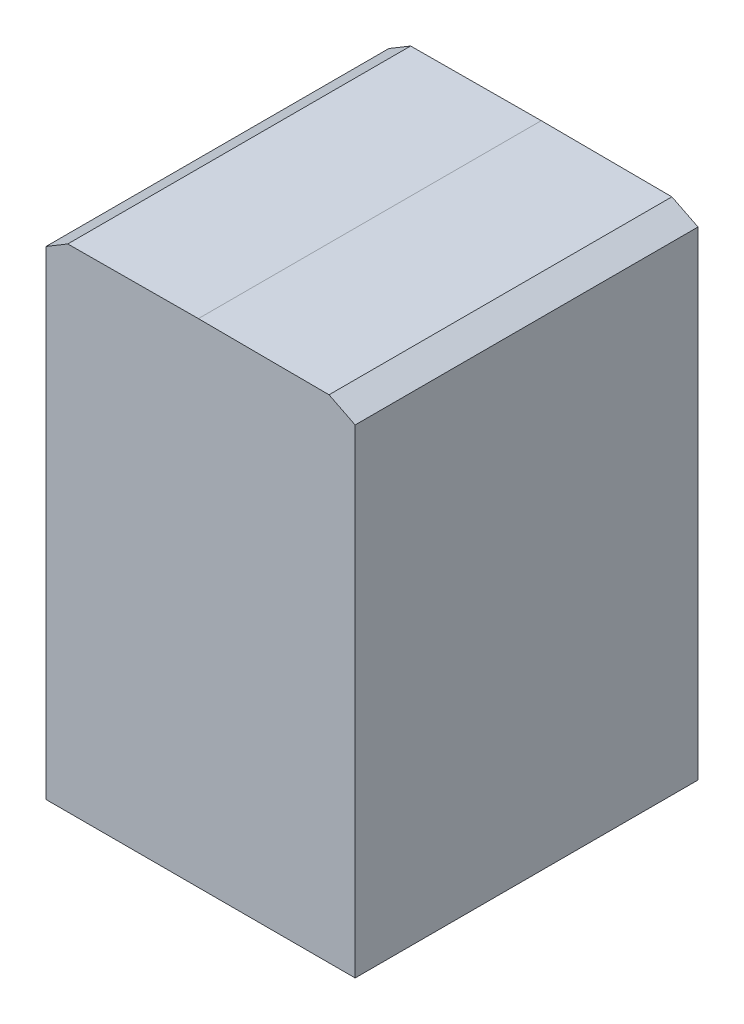
ISO-10303-21;
HEADER;
FILE_DESCRIPTION(('STEP AP214'),'2;1');
FILE_NAME('part.step','',(''),(''),'','','');
FILE_SCHEMA(('AUTOMOTIVE_DESIGN { 1 0 10303 214 1 1 1 1 }'));
ENDSEC;
DATA;
#1=APPLICATION_CONTEXT('core data for automotive mechanical design processes');
#2=APPLICATION_PROTOCOL_DEFINITION('international standard','automotive_design',2000,#1);
#3=PRODUCT_CONTEXT('',#1,'mechanical');
#4=PRODUCT('Part','Part','',(#3));
#5=PRODUCT_RELATED_PRODUCT_CATEGORY('part','',(#4));
#6=PRODUCT_DEFINITION_FORMATION('','',#4);
#7=PRODUCT_DEFINITION_CONTEXT('part definition',#1,'design');
#8=PRODUCT_DEFINITION('design','',#6,#7);
#9=PRODUCT_DEFINITION_SHAPE('','',#8);
#10=(LENGTH_UNIT() NAMED_UNIT(*) SI_UNIT(.MILLI.,.METRE.));
#11=(NAMED_UNIT(*) PLANE_ANGLE_UNIT() SI_UNIT($,.RADIAN.));
#12=(NAMED_UNIT(*) SI_UNIT($,.STERADIAN.) SOLID_ANGLE_UNIT());
#13=UNCERTAINTY_MEASURE_WITH_UNIT(LENGTH_MEASURE(1.E-05),#10,'distance_accuracy_value','');
#14=(GEOMETRIC_REPRESENTATION_CONTEXT(3) GLOBAL_UNCERTAINTY_ASSIGNED_CONTEXT((#13)) GLOBAL_UNIT_ASSIGNED_CONTEXT((#10,
#11,#12)) REPRESENTATION_CONTEXT('',''));
#15=CARTESIAN_POINT('',(0.,0.,0.));
#16=DIRECTION('',(0.,0.,1.));
#17=DIRECTION('',(1.,0.,0.));
#18=AXIS2_PLACEMENT_3D('',#15,#16,#17);
#19=CARTESIAN_POINT('',(-4.5085,6.7849623,0.));
#20=DIRECTION('',(-0.514495755428115,0.857492925712191,0.));
#21=DIRECTION('',(-0.857492925712191,-0.514495755428115,0.));
#22=AXIS2_PLACEMENT_3D('',#19,#20,#21);
#23=PLANE('',#22);
#24=DIRECTION('',(0.,0.,1.));
#25=VECTOR('',#24,1.);
#26=CARTESIAN_POINT('',(-3.8735,7.1659623,0.));
#27=LINE('',#26,#25);
#28=CARTESIAN_POINT('',(-3.87350000000013,7.16596230000022,0.));
#29=VERTEX_POINT('',#28);
#30=CARTESIAN_POINT('',(-3.87350000000013,7.16596230000022,10.));
#31=VERTEX_POINT('',#30);
#32=EDGE_CURVE('E94',#29,#31,#27,.T.);
#33=ORIENTED_EDGE('',*,*,#32,.F.);
#34=DIRECTION('',(-0.857492925712191,-0.514495755428115,0.));
#35=VECTOR('',#34,1.);
#36=CARTESIAN_POINT('',(-4.5085,6.7849623,0.));
#37=LINE('',#36,#35);
#38=CARTESIAN_POINT('',(-4.5085,6.7849623,0.));
#39=VERTEX_POINT('',#38);
#40=EDGE_CURVE('E89',#29,#39,#37,.T.);
#41=ORIENTED_EDGE('',*,*,#40,.T.);
#42=DIRECTION('',(0.,0.,1.));
#43=VECTOR('',#42,1.);
#44=CARTESIAN_POINT('',(-4.5085,6.7849623,0.));
#45=LINE('',#44,#43);
#46=CARTESIAN_POINT('',(-4.5085,6.7849623,10.));
#47=VERTEX_POINT('',#46);
#48=EDGE_CURVE('E91',#47,#39,#45,.F.);
#49=ORIENTED_EDGE('',*,*,#48,.F.);
#50=DIRECTION('',(-0.857492925712191,-0.514495755428115,0.));
#51=VECTOR('',#50,1.);
#52=CARTESIAN_POINT('',(-4.5085,6.7849623,10.));
#53=LINE('',#52,#51);
#54=EDGE_CURVE('E20',#47,#31,#53,.F.);
#55=ORIENTED_EDGE('',*,*,#54,.T.);
#56=EDGE_LOOP('',(#33,#41,#49,#55));
#57=FACE_BOUND('',#56,.T.);
#58=ADVANCED_FACE('F17',(#57),#23,.T.);
#59=CARTESIAN_POINT('',(-4.5085,-7.1850377,0.));
#60=DIRECTION('',(-1.,0.,0.));
#61=DIRECTION('',(0.,0.,1.));
#62=AXIS2_PLACEMENT_3D('',#59,#60,#61);
#63=PLANE('',#62);
#64=ORIENTED_EDGE('',*,*,#48,.T.);
#65=DIRECTION('',(0.,1.,0.));
#66=VECTOR('',#65,1.);
#67=CARTESIAN_POINT('',(-4.5085,6.7849623,0.));
#68=LINE('',#67,#66);
#69=CARTESIAN_POINT('',(-4.5085,-7.1850377,0.));
#70=VERTEX_POINT('',#69);
#71=EDGE_CURVE('E129',#39,#70,#68,.F.);
#72=ORIENTED_EDGE('',*,*,#71,.T.);
#73=DIRECTION('',(0.,0.,-1.));
#74=VECTOR('',#73,1.);
#75=CARTESIAN_POINT('',(-4.5085,-7.1850377,0.));
#76=LINE('',#75,#74);
#77=CARTESIAN_POINT('',(-4.5085,-7.1850377,10.));
#78=VERTEX_POINT('',#77);
#79=EDGE_CURVE('E97',#78,#70,#76,.T.);
#80=ORIENTED_EDGE('',*,*,#79,.F.);
#81=DIRECTION('',(0.,1.,0.));
#82=VECTOR('',#81,1.);
#83=CARTESIAN_POINT('',(-4.5085,6.7849623,10.));
#84=LINE('',#83,#82);
#85=EDGE_CURVE('E81',#47,#78,#84,.F.);
#86=ORIENTED_EDGE('',*,*,#85,.F.);
#87=EDGE_LOOP('',(#64,#72,#80,#86));
#88=FACE_BOUND('',#87,.T.);
#89=ADVANCED_FACE('F96',(#88),#63,.T.);
#90=CARTESIAN_POINT('',(-0.06349999999999,7.1850377,0.));
#91=DIRECTION('',(0.00500660391751134,0.999987466880067,0.));
#92=DIRECTION('',(-0.999987466880067,0.00500660391751134,0.));
#93=AXIS2_PLACEMENT_3D('',#90,#91,#92);
#94=PLANE('',#93);
#95=DIRECTION('',(0.,0.,1.));
#96=VECTOR('',#95,1.);
#97=CARTESIAN_POINT('',(3.7465,7.1659623,0.));
#98=LINE('',#97,#96);
#99=CARTESIAN_POINT('',(3.7465,7.1659623,0.));
#100=VERTEX_POINT('',#99);
#101=CARTESIAN_POINT('',(3.7465,7.1659623,10.));
#102=VERTEX_POINT('',#101);
#103=EDGE_CURVE('E73',#100,#102,#98,.T.);
#104=ORIENTED_EDGE('',*,*,#103,.F.);
#105=DIRECTION('',(-0.999987466880067,0.00500660391751278,0.));
#106=VECTOR('',#105,1.);
#107=CARTESIAN_POINT('',(3.7465,7.1659623,0.));
#108=LINE('',#107,#106);
#109=CARTESIAN_POINT('',(-0.0634999999990455,7.1850377,0.));
#110=VERTEX_POINT('',#109);
#111=EDGE_CURVE('E118',#100,#110,#108,.T.);
#112=ORIENTED_EDGE('',*,*,#111,.T.);
#113=DIRECTION('',(0.,0.,1.));
#114=VECTOR('',#113,1.);
#115=CARTESIAN_POINT('',(-0.0634999999999898,7.18503769999999,0.));
#116=LINE('',#115,#114);
#117=CARTESIAN_POINT('',(-0.0634999999990455,7.1850377,10.));
#118=VERTEX_POINT('',#117);
#119=EDGE_CURVE('E104',#118,#110,#116,.F.);
#120=ORIENTED_EDGE('',*,*,#119,.F.);
#121=DIRECTION('',(-0.999987466880067,0.00500660391751278,0.));
#122=VECTOR('',#121,1.);
#123=CARTESIAN_POINT('',(3.7465,7.1659623,10.));
#124=LINE('',#123,#122);
#125=EDGE_CURVE('E102',#102,#118,#124,.T.);
#126=ORIENTED_EDGE('',*,*,#125,.F.);
#127=EDGE_LOOP('',(#104,#112,#120,#126));
#128=FACE_BOUND('',#127,.T.);
#129=ADVANCED_FACE('F136',(#128),#94,.T.);
#130=CARTESIAN_POINT('',(-3.8735,7.1659623,0.));
#131=DIRECTION('',(-0.00500660391751134,0.999987466880067,0.));
#132=DIRECTION('',(-0.999987466880067,-0.00500660391751134,0.));
#133=AXIS2_PLACEMENT_3D('',#130,#131,#132);
#134=PLANE('',#133);
#135=ORIENTED_EDGE('',*,*,#119,.T.);
#136=DIRECTION('',(-0.999987466880067,-0.00500660391751275,0.));
#137=VECTOR('',#136,1.);
#138=CARTESIAN_POINT('',(-0.0634999999999898,7.1850377,0.));
#139=LINE('',#138,#137);
#140=EDGE_CURVE('E114',#110,#29,#139,.T.);
#141=ORIENTED_EDGE('',*,*,#140,.T.);
#142=ORIENTED_EDGE('',*,*,#32,.T.);
#143=DIRECTION('',(-0.999987466880067,-0.00500660391751275,0.));
#144=VECTOR('',#143,1.);
#145=CARTESIAN_POINT('',(-0.0634999999999898,7.1850377,10.));
#146=LINE('',#145,#144);
#147=EDGE_CURVE('E85',#118,#31,#146,.T.);
#148=ORIENTED_EDGE('',*,*,#147,.F.);
#149=EDGE_LOOP('',(#135,#141,#142,#148));
#150=FACE_BOUND('',#149,.T.);
#151=ADVANCED_FACE('F112',(#150),#134,.T.);
#152=CARTESIAN_POINT('',(3.7465,7.1659623,0.));
#153=DIRECTION('',(0.447213595499958,0.894427190999916,0.));
#154=DIRECTION('',(-0.894427190999916,0.447213595499958,0.));
#155=AXIS2_PLACEMENT_3D('',#152,#153,#154);
#156=PLANE('',#155);
#157=DIRECTION('',(0.,0.,-1.));
#158=VECTOR('',#157,1.);
#159=CARTESIAN_POINT('',(4.5085,6.7849623,0.));
#160=LINE('',#159,#158);
#161=CARTESIAN_POINT('',(4.5085,6.7849623,0.));
#162=VERTEX_POINT('',#161);
#163=CARTESIAN_POINT('',(4.5085,6.7849623,10.));
#164=VERTEX_POINT('',#163);
#165=EDGE_CURVE('E117',#162,#164,#160,.F.);
#166=ORIENTED_EDGE('',*,*,#165,.F.);
#167=DIRECTION('',(-0.894427190999916,0.447213595499959,0.));
#168=VECTOR('',#167,1.);
#169=CARTESIAN_POINT('',(4.5085,6.7849623,0.));
#170=LINE('',#169,#168);
#171=EDGE_CURVE('E123',#162,#100,#170,.T.);
#172=ORIENTED_EDGE('',*,*,#171,.T.);
#173=ORIENTED_EDGE('',*,*,#103,.T.);
#174=DIRECTION('',(-0.894427190999916,0.447213595499959,0.));
#175=VECTOR('',#174,1.);
#176=CARTESIAN_POINT('',(4.5085,6.7849623,10.));
#177=LINE('',#176,#175);
#178=EDGE_CURVE('E99',#164,#102,#177,.T.);
#179=ORIENTED_EDGE('',*,*,#178,.F.);
#180=EDGE_LOOP('',(#166,#172,#173,#179));
#181=FACE_BOUND('',#180,.T.);
#182=ADVANCED_FACE('F153',(#181),#156,.T.);
#183=CARTESIAN_POINT('',(-4.5085,6.7849623,10.));
#184=DIRECTION('',(0.,0.,1.));
#185=DIRECTION('',(1.,0.,0.));
#186=AXIS2_PLACEMENT_3D('',#183,#184,#185);
#187=PLANE('',#186);
#188=ORIENTED_EDGE('',*,*,#147,.T.);
#189=ORIENTED_EDGE('',*,*,#54,.F.);
#190=ORIENTED_EDGE('',*,*,#85,.T.);
#191=DIRECTION('',(1.,0.,0.));
#192=VECTOR('',#191,1.);
#193=CARTESIAN_POINT('',(4.5085,-7.1850377,10.));
#194=LINE('',#193,#192);
#195=CARTESIAN_POINT('',(4.5085,-7.1850377,10.));
#196=VERTEX_POINT('',#195);
#197=EDGE_CURVE('E132',#196,#78,#194,.F.);
#198=ORIENTED_EDGE('',*,*,#197,.F.);
#199=DIRECTION('',(0.,1.,0.));
#200=VECTOR('',#199,1.);
#201=CARTESIAN_POINT('',(4.5085,6.7849623,10.));
#202=LINE('',#201,#200);
#203=EDGE_CURVE('E121',#164,#196,#202,.F.);
#204=ORIENTED_EDGE('',*,*,#203,.F.);
#205=ORIENTED_EDGE('',*,*,#178,.T.);
#206=ORIENTED_EDGE('',*,*,#125,.T.);
#207=EDGE_LOOP('',(#188,#189,#190,#198,#204,#205,#206));
#208=FACE_BOUND('',#207,.T.);
#209=ADVANCED_FACE('F79',(#208),#187,.T.);
#210=CARTESIAN_POINT('',(4.5085,-7.1850377,0.));
#211=DIRECTION('',(0.,-1.,0.));
#212=DIRECTION('',(0.,0.,-1.));
#213=AXIS2_PLACEMENT_3D('',#210,#211,#212);
#214=PLANE('',#213);
#215=ORIENTED_EDGE('',*,*,#79,.T.);
#216=DIRECTION('',(1.,0.,0.));
#217=VECTOR('',#216,1.);
#218=CARTESIAN_POINT('',(-4.5085,-7.1850377,0.));
#219=LINE('',#218,#217);
#220=CARTESIAN_POINT('',(4.5085,-7.1850377,0.));
#221=VERTEX_POINT('',#220);
#222=EDGE_CURVE('E35',#70,#221,#219,.T.);
#223=ORIENTED_EDGE('',*,*,#222,.T.);
#224=DIRECTION('',(0.,0.,-1.));
#225=VECTOR('',#224,1.);
#226=CARTESIAN_POINT('',(4.5085,-7.1850377,0.));
#227=LINE('',#226,#225);
#228=EDGE_CURVE('E26',#196,#221,#227,.T.);
#229=ORIENTED_EDGE('',*,*,#228,.F.);
#230=ORIENTED_EDGE('',*,*,#197,.T.);
#231=EDGE_LOOP('',(#215,#223,#229,#230));
#232=FACE_BOUND('',#231,.T.);
#233=ADVANCED_FACE('F144',(#232),#214,.T.);
#234=CARTESIAN_POINT('',(-4.5085,6.7849623,0.));
#235=DIRECTION('',(0.,0.,1.));
#236=DIRECTION('',(1.,0.,0.));
#237=AXIS2_PLACEMENT_3D('',#234,#235,#236);
#238=PLANE('',#237);
#239=ORIENTED_EDGE('',*,*,#140,.F.);
#240=ORIENTED_EDGE('',*,*,#111,.F.);
#241=ORIENTED_EDGE('',*,*,#171,.F.);
#242=DIRECTION('',(0.,1.,0.));
#243=VECTOR('',#242,1.);
#244=CARTESIAN_POINT('',(4.5085,6.7849623,0.));
#245=LINE('',#244,#243);
#246=EDGE_CURVE('E11',#221,#162,#245,.T.);
#247=ORIENTED_EDGE('',*,*,#246,.F.);
#248=ORIENTED_EDGE('',*,*,#222,.F.);
#249=ORIENTED_EDGE('',*,*,#71,.F.);
#250=ORIENTED_EDGE('',*,*,#40,.F.);
#251=EDGE_LOOP('',(#239,#240,#241,#247,#248,#249,#250));
#252=FACE_BOUND('',#251,.T.);
#253=ADVANCED_FACE('F138',(#252),#238,.F.);
#254=CARTESIAN_POINT('',(4.5085,6.7849623,0.));
#255=DIRECTION('',(1.,0.,0.));
#256=DIRECTION('',(0.,0.,-1.));
#257=AXIS2_PLACEMENT_3D('',#254,#255,#256);
#258=PLANE('',#257);
#259=ORIENTED_EDGE('',*,*,#228,.T.);
#260=ORIENTED_EDGE('',*,*,#246,.T.);
#261=ORIENTED_EDGE('',*,*,#165,.T.);
#262=ORIENTED_EDGE('',*,*,#203,.T.);
#263=EDGE_LOOP('',(#259,#260,#261,#262));
#264=FACE_BOUND('',#263,.T.);
#265=ADVANCED_FACE('F141',(#264),#258,.T.);
#266=CLOSED_SHELL('',(#58,#89,#129,#151,#182,#209,#233,#253,#265));
#267=MANIFOLD_SOLID_BREP('B1',#266);
#268=ADVANCED_BREP_SHAPE_REPRESENTATION('',(#18,#267),#14);
#269=SHAPE_DEFINITION_REPRESENTATION(#9,#268);
ENDSEC;
END-ISO-10303-21;
